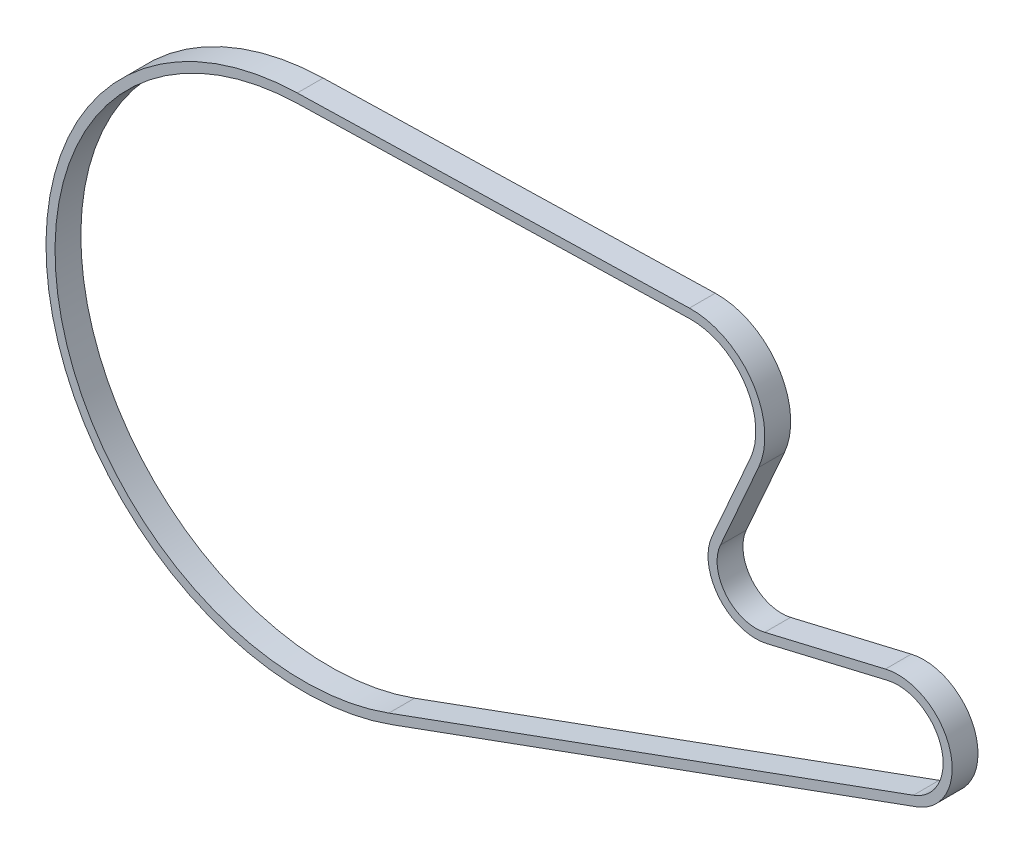
ISO-10303-21;
HEADER;
FILE_DESCRIPTION(('STEP AP214'),'2;1');
FILE_NAME('part.step','',(''),(''),'','','');
FILE_SCHEMA(('AUTOMOTIVE_DESIGN { 1 0 10303 214 1 1 1 1 }'));
ENDSEC;
DATA;
#1=APPLICATION_CONTEXT('core data for automotive mechanical design processes');
#2=APPLICATION_PROTOCOL_DEFINITION('international standard','automotive_design',2000,#1);
#3=PRODUCT_CONTEXT('',#1,'mechanical');
#4=PRODUCT('Part','Part','',(#3));
#5=PRODUCT_RELATED_PRODUCT_CATEGORY('part','',(#4));
#6=PRODUCT_DEFINITION_FORMATION('','',#4);
#7=PRODUCT_DEFINITION_CONTEXT('part definition',#1,'design');
#8=PRODUCT_DEFINITION('design','',#6,#7);
#9=PRODUCT_DEFINITION_SHAPE('','',#8);
#10=(LENGTH_UNIT() NAMED_UNIT(*) SI_UNIT(.MILLI.,.METRE.));
#11=(NAMED_UNIT(*) PLANE_ANGLE_UNIT() SI_UNIT($,.RADIAN.));
#12=(NAMED_UNIT(*) SI_UNIT($,.STERADIAN.) SOLID_ANGLE_UNIT());
#13=UNCERTAINTY_MEASURE_WITH_UNIT(LENGTH_MEASURE(1.E-05),#10,'distance_accuracy_value','');
#14=(GEOMETRIC_REPRESENTATION_CONTEXT(3) GLOBAL_UNCERTAINTY_ASSIGNED_CONTEXT((#13)) GLOBAL_UNIT_ASSIGNED_CONTEXT((#10,
#11,#12)) REPRESENTATION_CONTEXT('',''));
#15=CARTESIAN_POINT('',(0.,0.,0.));
#16=DIRECTION('',(0.,0.,1.));
#17=DIRECTION('',(1.,0.,0.));
#18=AXIS2_PLACEMENT_3D('',#15,#16,#17);
#19=CARTESIAN_POINT('',(0.,0.,2.));
#20=DIRECTION('',(0.,0.,1.));
#21=DIRECTION('',(1.,0.,0.));
#22=AXIS2_PLACEMENT_3D('',#19,#20,#21);
#23=PLANE('',#22);
#24=CARTESIAN_POINT('',(0.,0.,2.));
#25=DIRECTION('',(0.,0.,1.));
#26=DIRECTION('',(1.,0.,0.));
#27=AXIS2_PLACEMENT_3D('',#24,#25,#26);
#28=CIRCLE('',#27,19.95);
#29=CARTESIAN_POINT('',(-0.495670709518835,19.9438414190377,2.));
#30=VERTEX_POINT('',#29);
#31=CARTESIAN_POINT('',(6.83070652173879,-18.7441710516596,2.));
#32=VERTEX_POINT('',#31);
#33=EDGE_CURVE('E246',#30,#32,#28,.T.);
#34=ORIENTED_EDGE('',*,*,#33,.T.);
#35=DIRECTION('',(0.939557446198478,0.342391304347809,0.));
#36=VECTOR('',#35,1.);
#37=CARTESIAN_POINT('',(6.83070652173879,-18.7441710516596,2.));
#38=LINE('',#37,#36);
#39=CARTESIAN_POINT('',(47.4380434782631,-3.9461412740336,2.));
#40=VERTEX_POINT('',#39);
#41=EDGE_CURVE('E250',#32,#40,#38,.T.);
#42=ORIENTED_EDGE('',*,*,#41,.T.);
#43=CARTESIAN_POINT('',(46.0000000000023,0.,2.));
#44=DIRECTION('',(0.,0.,1.));
#45=DIRECTION('',(1.,0.,0.));
#46=AXIS2_PLACEMENT_3D('',#43,#44,#45);
#47=CIRCLE('',#46,4.19999999999999);
#48=CARTESIAN_POINT('',(45.0343818497446,4.08749086701033,2.));
#49=VERTEX_POINT('',#48);
#50=EDGE_CURVE('E254',#40,#49,#47,.T.);
#51=ORIENTED_EDGE('',*,*,#50,.T.);
#52=DIRECTION('',(-0.973212111192934,-0.229909083394701,0.));
#53=VECTOR('',#52,1.);
#54=CARTESIAN_POINT('',(45.0343818497446,4.08749086701033,2.));
#55=LINE('',#54,#53);
#56=CARTESIAN_POINT('',(35.6915455822925,1.8803636664212,2.));
#57=VERTEX_POINT('',#56);
#58=EDGE_CURVE('E257',#49,#57,#55,.T.);
#59=ORIENTED_EDGE('',*,*,#58,.T.);
#60=CARTESIAN_POINT('',(35.0018183321084,4.8,2.));
#61=DIRECTION('',(0.,0.,-1.));
#62=DIRECTION('',(1.,0.,0.));
#63=AXIS2_PLACEMENT_3D('',#60,#61,#62);
#64=CIRCLE('',#63,3.);
#65=CARTESIAN_POINT('',(32.2581623249961,6.01340500849347,2.));
#66=VERTEX_POINT('',#65);
#67=EDGE_CURVE('E260',#57,#66,#64,.T.);
#68=ORIENTED_EDGE('',*,*,#67,.T.);
#69=DIRECTION('',(0.40446833616449,0.914552002370739,0.));
#70=VECTOR('',#69,1.);
#71=CARTESIAN_POINT('',(35.2129464135156,12.6945304838624,2.));
#72=LINE('',#71,#70);
#73=CARTESIAN_POINT('',(35.2129464135156,12.6945304838624,2.));
#74=VERTEX_POINT('',#73);
#75=EDGE_CURVE('E263',#66,#74,#72,.T.);
#76=ORIENTED_EDGE('',*,*,#75,.T.);
#77=CARTESIAN_POINT('',(30.0000000000023,15.,2.));
#78=DIRECTION('',(0.,0.,1.));
#79=DIRECTION('',(1.,0.,0.));
#80=AXIS2_PLACEMENT_3D('',#77,#78,#79);
#81=CIRCLE('',#80,5.70000000000003);
#82=CARTESIAN_POINT('',(29.8583797972826,20.6982404054394,2.));
#83=VERTEX_POINT('',#82);
#84=EDGE_CURVE('E266',#74,#83,#81,.T.);
#85=ORIENTED_EDGE('',*,*,#84,.T.);
#86=DIRECTION('',(-0.999691299199886,-0.0248456495999414,0.));
#87=VECTOR('',#86,1.);
#88=CARTESIAN_POINT('',(29.8583797972826,20.6982404054394,2.));
#89=LINE('',#88,#87);
#90=EDGE_CURVE('E269',#83,#30,#89,.T.);
#91=ORIENTED_EDGE('',*,*,#90,.T.);
#92=EDGE_LOOP('',(#34,#42,#51,#59,#68,#76,#85,#91));
#93=FACE_BOUND('',#92,.T.);
#94=DIRECTION('',(0.939557446198478,0.342391304347809,0.));
#95=VECTOR('',#94,1.);
#96=CARTESIAN_POINT('',(6.59103260869532,-18.0864808393207,2.));
#97=LINE('',#96,#95);
#98=CARTESIAN_POINT('',(6.59103260869532,-18.0864808393207,2.));
#99=VERTEX_POINT('',#98);
#100=CARTESIAN_POINT('',(47.1983695652196,-3.28845106169467,2.));
#101=VERTEX_POINT('',#100);
#102=EDGE_CURVE('E166',#99,#101,#97,.T.);
#103=ORIENTED_EDGE('',*,*,#102,.F.);
#104=CARTESIAN_POINT('',(0.,0.,2.));
#105=DIRECTION('',(0.,0.,1.));
#106=DIRECTION('',(1.,0.,0.));
#107=AXIS2_PLACEMENT_3D('',#104,#105,#106);
#108=CIRCLE('',#107,19.25);
#109=CARTESIAN_POINT('',(-0.478278754798875,19.2440575095978,2.));
#110=VERTEX_POINT('',#109);
#111=EDGE_CURVE('E157',#110,#99,#108,.T.);
#112=ORIENTED_EDGE('',*,*,#111,.F.);
#113=DIRECTION('',(-0.999691299199886,-0.0248456495999413,0.));
#114=VECTOR('',#113,1.);
#115=CARTESIAN_POINT('',(29.8757717520026,19.9984564959994,2.));
#116=LINE('',#115,#114);
#117=CARTESIAN_POINT('',(29.8757717520026,19.9984564959994,2.));
#118=VERTEX_POINT('',#117);
#119=EDGE_CURVE('E198',#118,#110,#116,.T.);
#120=ORIENTED_EDGE('',*,*,#119,.F.);
#121=CARTESIAN_POINT('',(30.0000000000023,15.,2.));
#122=DIRECTION('',(0.,0.,1.));
#123=DIRECTION('',(1.,0.,0.));
#124=AXIS2_PLACEMENT_3D('',#121,#122,#123);
#125=CIRCLE('',#124,5.00000000000003);
#126=CARTESIAN_POINT('',(34.5727600118561,12.9776583191775,2.));
#127=VERTEX_POINT('',#126);
#128=EDGE_CURVE('E195',#127,#118,#125,.T.);
#129=ORIENTED_EDGE('',*,*,#128,.F.);
#130=DIRECTION('',(0.40446833616449,0.914552002370739,0.));
#131=VECTOR('',#130,1.);
#132=CARTESIAN_POINT('',(34.5727600118561,12.9776583191775,2.));
#133=LINE('',#132,#131);
#134=CARTESIAN_POINT('',(31.6179759233366,6.29653284380861,2.));
#135=VERTEX_POINT('',#134);
#136=EDGE_CURVE('E192',#135,#127,#133,.T.);
#137=ORIENTED_EDGE('',*,*,#136,.F.);
#138=CARTESIAN_POINT('',(35.0018183321084,4.8,2.));
#139=DIRECTION('',(0.,0.,-1.));
#140=DIRECTION('',(1.,0.,0.));
#141=AXIS2_PLACEMENT_3D('',#138,#139,#140);
#142=CIRCLE('',#141,3.7);
#143=CARTESIAN_POINT('',(35.8524819406688,1.19911518858614,2.));
#144=VERTEX_POINT('',#143);
#145=EDGE_CURVE('E189',#144,#135,#142,.T.);
#146=ORIENTED_EDGE('',*,*,#145,.F.);
#147=DIRECTION('',(-0.973212111192934,-0.229909083394701,0.));
#148=VECTOR('',#147,1.);
#149=CARTESIAN_POINT('',(45.1953182081209,3.40624238917527,2.));
#150=LINE('',#149,#148);
#151=CARTESIAN_POINT('',(45.1953182081209,3.40624238917528,2.));
#152=VERTEX_POINT('',#151);
#153=EDGE_CURVE('E184',#152,#144,#150,.T.);
#154=ORIENTED_EDGE('',*,*,#153,.F.);
#155=CARTESIAN_POINT('',(46.0000000000023,0.,2.));
#156=DIRECTION('',(0.,0.,1.));
#157=DIRECTION('',(1.,0.,0.));
#158=AXIS2_PLACEMENT_3D('',#155,#156,#157);
#159=CIRCLE('',#158,3.49999999999999);
#160=EDGE_CURVE('E180',#101,#152,#159,.T.);
#161=ORIENTED_EDGE('',*,*,#160,.F.);
#162=EDGE_LOOP('',(#103,#112,#120,#129,#137,#146,#154,#161));
#163=FACE_BOUND('',#162,.T.);
#164=ADVANCED_FACE('F43',(#93,#163),#23,.T.);
#165=CARTESIAN_POINT('',(0.,0.,0.));
#166=DIRECTION('',(0.,0.,1.));
#167=DIRECTION('',(1.,0.,0.));
#168=AXIS2_PLACEMENT_3D('',#165,#166,#167);
#169=PLANE('',#168);
#170=CARTESIAN_POINT('',(0.,0.,0.));
#171=DIRECTION('',(0.,0.,1.));
#172=DIRECTION('',(1.,0.,0.));
#173=AXIS2_PLACEMENT_3D('',#170,#171,#172);
#174=CIRCLE('',#173,19.95);
#175=CARTESIAN_POINT('',(-0.495670709518835,19.9438414190377,0.));
#176=VERTEX_POINT('',#175);
#177=CARTESIAN_POINT('',(6.83070652173879,-18.7441710516596,0.));
#178=VERTEX_POINT('',#177);
#179=EDGE_CURVE('E175',#176,#178,#174,.T.);
#180=ORIENTED_EDGE('',*,*,#179,.F.);
#181=DIRECTION('',(-0.999691299199886,-0.0248456495999414,0.));
#182=VECTOR('',#181,1.);
#183=CARTESIAN_POINT('',(29.8583797972826,20.6982404054394,0.));
#184=LINE('',#183,#182);
#185=CARTESIAN_POINT('',(29.8583797972826,20.6982404054394,0.));
#186=VERTEX_POINT('',#185);
#187=EDGE_CURVE('E251',#186,#176,#184,.T.);
#188=ORIENTED_EDGE('',*,*,#187,.F.);
#189=CARTESIAN_POINT('',(30.0000000000023,15.,0.));
#190=DIRECTION('',(0.,0.,1.));
#191=DIRECTION('',(1.,0.,0.));
#192=AXIS2_PLACEMENT_3D('',#189,#190,#191);
#193=CIRCLE('',#192,5.70000000000003);
#194=CARTESIAN_POINT('',(35.2129464135156,12.6945304838624,0.));
#195=VERTEX_POINT('',#194);
#196=EDGE_CURVE('E291',#195,#186,#193,.T.);
#197=ORIENTED_EDGE('',*,*,#196,.F.);
#198=DIRECTION('',(0.40446833616449,0.914552002370739,0.));
#199=VECTOR('',#198,1.);
#200=CARTESIAN_POINT('',(35.2129464135156,12.6945304838624,0.));
#201=LINE('',#200,#199);
#202=CARTESIAN_POINT('',(32.2581623249961,6.01340500849347,0.));
#203=VERTEX_POINT('',#202);
#204=EDGE_CURVE('E288',#203,#195,#201,.T.);
#205=ORIENTED_EDGE('',*,*,#204,.F.);
#206=CARTESIAN_POINT('',(35.0018183321084,4.8,0.));
#207=DIRECTION('',(0.,0.,-1.));
#208=DIRECTION('',(1.,0.,0.));
#209=AXIS2_PLACEMENT_3D('',#206,#207,#208);
#210=CIRCLE('',#209,3.);
#211=CARTESIAN_POINT('',(35.6915455822925,1.8803636664212,0.));
#212=VERTEX_POINT('',#211);
#213=EDGE_CURVE('E285',#212,#203,#210,.T.);
#214=ORIENTED_EDGE('',*,*,#213,.F.);
#215=DIRECTION('',(-0.973212111192934,-0.229909083394701,0.));
#216=VECTOR('',#215,1.);
#217=CARTESIAN_POINT('',(45.0343818497446,4.08749086701033,0.));
#218=LINE('',#217,#216);
#219=CARTESIAN_POINT('',(45.0343818497446,4.08749086701033,0.));
#220=VERTEX_POINT('',#219);
#221=EDGE_CURVE('E282',#220,#212,#218,.T.);
#222=ORIENTED_EDGE('',*,*,#221,.F.);
#223=CARTESIAN_POINT('',(46.0000000000023,0.,0.));
#224=DIRECTION('',(0.,0.,1.));
#225=DIRECTION('',(1.,0.,0.));
#226=AXIS2_PLACEMENT_3D('',#223,#224,#225);
#227=CIRCLE('',#226,4.19999999999999);
#228=CARTESIAN_POINT('',(47.4380434782631,-3.9461412740336,0.));
#229=VERTEX_POINT('',#228);
#230=EDGE_CURVE('E279',#229,#220,#227,.T.);
#231=ORIENTED_EDGE('',*,*,#230,.F.);
#232=DIRECTION('',(0.939557446198478,0.342391304347809,0.));
#233=VECTOR('',#232,1.);
#234=CARTESIAN_POINT('',(6.83070652173879,-18.7441710516596,0.));
#235=LINE('',#234,#233);
#236=EDGE_CURVE('E276',#178,#229,#235,.T.);
#237=ORIENTED_EDGE('',*,*,#236,.F.);
#238=EDGE_LOOP('',(#180,#188,#197,#205,#214,#222,#231,#237));
#239=FACE_BOUND('',#238,.T.);
#240=CARTESIAN_POINT('',(0.,0.,0.));
#241=DIRECTION('',(0.,0.,1.));
#242=DIRECTION('',(1.,0.,0.));
#243=AXIS2_PLACEMENT_3D('',#240,#241,#242);
#244=CIRCLE('',#243,19.25);
#245=CARTESIAN_POINT('',(-0.478278754798875,19.2440575095978,0.));
#246=VERTEX_POINT('',#245);
#247=CARTESIAN_POINT('',(6.59103260869532,-18.0864808393207,0.));
#248=VERTEX_POINT('',#247);
#249=EDGE_CURVE('E67',#246,#248,#244,.T.);
#250=ORIENTED_EDGE('',*,*,#249,.T.);
#251=DIRECTION('',(0.939557446198478,0.342391304347809,0.));
#252=VECTOR('',#251,1.);
#253=CARTESIAN_POINT('',(6.59103260869532,-18.0864808393207,0.));
#254=LINE('',#253,#252);
#255=CARTESIAN_POINT('',(47.1983695652196,-3.28845106169467,0.));
#256=VERTEX_POINT('',#255);
#257=EDGE_CURVE('E173',#248,#256,#254,.T.);
#258=ORIENTED_EDGE('',*,*,#257,.T.);
#259=CARTESIAN_POINT('',(46.0000000000023,0.,0.));
#260=DIRECTION('',(0.,0.,1.));
#261=DIRECTION('',(1.,0.,0.));
#262=AXIS2_PLACEMENT_3D('',#259,#260,#261);
#263=CIRCLE('',#262,3.49999999999999);
#264=CARTESIAN_POINT('',(45.1953182081209,3.40624238917528,0.));
#265=VERTEX_POINT('',#264);
#266=EDGE_CURVE('E205',#256,#265,#263,.T.);
#267=ORIENTED_EDGE('',*,*,#266,.T.);
#268=DIRECTION('',(-0.973212111192934,-0.229909083394701,0.));
#269=VECTOR('',#268,1.);
#270=CARTESIAN_POINT('',(45.1953182081209,3.40624238917527,0.));
#271=LINE('',#270,#269);
#272=CARTESIAN_POINT('',(35.8524819406688,1.19911518858614,0.));
#273=VERTEX_POINT('',#272);
#274=EDGE_CURVE('E209',#265,#273,#271,.T.);
#275=ORIENTED_EDGE('',*,*,#274,.T.);
#276=CARTESIAN_POINT('',(35.0018183321084,4.8,0.));
#277=DIRECTION('',(0.,0.,-1.));
#278=DIRECTION('',(1.,0.,0.));
#279=AXIS2_PLACEMENT_3D('',#276,#277,#278);
#280=CIRCLE('',#279,3.7);
#281=CARTESIAN_POINT('',(31.6179759233366,6.29653284380861,0.));
#282=VERTEX_POINT('',#281);
#283=EDGE_CURVE('E213',#273,#282,#280,.T.);
#284=ORIENTED_EDGE('',*,*,#283,.T.);
#285=DIRECTION('',(0.40446833616449,0.914552002370739,0.));
#286=VECTOR('',#285,1.);
#287=CARTESIAN_POINT('',(34.5727600118561,12.9776583191775,0.));
#288=LINE('',#287,#286);
#289=CARTESIAN_POINT('',(34.5727600118561,12.9776583191775,0.));
#290=VERTEX_POINT('',#289);
#291=EDGE_CURVE('E217',#282,#290,#288,.T.);
#292=ORIENTED_EDGE('',*,*,#291,.T.);
#293=CARTESIAN_POINT('',(30.0000000000023,15.,0.));
#294=DIRECTION('',(0.,0.,1.));
#295=DIRECTION('',(1.,0.,0.));
#296=AXIS2_PLACEMENT_3D('',#293,#294,#295);
#297=CIRCLE('',#296,5.00000000000003);
#298=CARTESIAN_POINT('',(29.8757717520026,19.9984564959995,0.));
#299=VERTEX_POINT('',#298);
#300=EDGE_CURVE('E221',#290,#299,#297,.T.);
#301=ORIENTED_EDGE('',*,*,#300,.T.);
#302=DIRECTION('',(-0.999691299199886,-0.0248456495999413,0.));
#303=VECTOR('',#302,1.);
#304=CARTESIAN_POINT('',(29.8757717520026,19.9984564959994,0.));
#305=LINE('',#304,#303);
#306=EDGE_CURVE('E167',#299,#246,#305,.T.);
#307=ORIENTED_EDGE('',*,*,#306,.T.);
#308=EDGE_LOOP('',(#250,#258,#267,#275,#284,#292,#301,#307));
#309=FACE_BOUND('',#308,.T.);
#310=ADVANCED_FACE('F330',(#239,#309),#169,.F.);
#311=CARTESIAN_POINT('',(0.,0.,2.));
#312=DIRECTION('',(0.,0.,-1.));
#313=DIRECTION('',(-1.,0.,0.));
#314=AXIS2_PLACEMENT_3D('',#311,#312,#313);
#315=CYLINDRICAL_SURFACE('',#314,19.95);
#316=ORIENTED_EDGE('',*,*,#179,.T.);
#317=DIRECTION('',(0.,0.,-1.));
#318=VECTOR('',#317,1.);
#319=CARTESIAN_POINT('',(6.83070652173879,-18.7441710516596,2.));
#320=LINE('',#319,#318);
#321=EDGE_CURVE('E11',#32,#178,#320,.T.);
#322=ORIENTED_EDGE('',*,*,#321,.F.);
#323=ORIENTED_EDGE('',*,*,#33,.F.);
#324=DIRECTION('',(0.,0.,-1.));
#325=VECTOR('',#324,1.);
#326=CARTESIAN_POINT('',(-0.495670709518835,19.9438414190377,2.));
#327=LINE('',#326,#325);
#328=EDGE_CURVE('E272',#30,#176,#327,.T.);
#329=ORIENTED_EDGE('',*,*,#328,.T.);
#330=EDGE_LOOP('',(#316,#322,#323,#329));
#331=FACE_BOUND('',#330,.T.);
#332=ADVANCED_FACE('F45',(#331),#315,.T.);
#333=CARTESIAN_POINT('',(6.83070652173879,-18.7441710516596,2.));
#334=DIRECTION('',(-0.342391304347809,0.939557446198478,0.));
#335=DIRECTION('',(-0.939557446198478,-0.342391304347809,0.));
#336=AXIS2_PLACEMENT_3D('',#333,#334,#335);
#337=PLANE('',#336);
#338=ORIENTED_EDGE('',*,*,#236,.T.);
#339=DIRECTION('',(0.,0.,-1.));
#340=VECTOR('',#339,1.);
#341=CARTESIAN_POINT('',(47.4380434782631,-3.9461412740336,2.));
#342=LINE('',#341,#340);
#343=EDGE_CURVE('E52',#40,#229,#342,.T.);
#344=ORIENTED_EDGE('',*,*,#343,.F.);
#345=ORIENTED_EDGE('',*,*,#41,.F.);
#346=ORIENTED_EDGE('',*,*,#321,.T.);
#347=EDGE_LOOP('',(#338,#344,#345,#346));
#348=FACE_BOUND('',#347,.T.);
#349=ADVANCED_FACE('F347',(#348),#337,.F.);
#350=CARTESIAN_POINT('',(46.0000000000023,0.,2.));
#351=DIRECTION('',(0.,0.,-1.));
#352=DIRECTION('',(-1.,0.,0.));
#353=AXIS2_PLACEMENT_3D('',#350,#351,#352);
#354=CYLINDRICAL_SURFACE('',#353,4.19999999999999);
#355=ORIENTED_EDGE('',*,*,#230,.T.);
#356=DIRECTION('',(0.,0.,-1.));
#357=VECTOR('',#356,1.);
#358=CARTESIAN_POINT('',(45.0343818497446,4.08749086701033,2.));
#359=LINE('',#358,#357);
#360=EDGE_CURVE('E315',#49,#220,#359,.T.);
#361=ORIENTED_EDGE('',*,*,#360,.F.);
#362=ORIENTED_EDGE('',*,*,#50,.F.);
#363=ORIENTED_EDGE('',*,*,#343,.T.);
#364=EDGE_LOOP('',(#355,#361,#362,#363));
#365=FACE_BOUND('',#364,.T.);
#366=ADVANCED_FACE('F324',(#365),#354,.T.);
#367=CARTESIAN_POINT('',(45.0343818497446,4.08749086701033,2.));
#368=DIRECTION('',(0.229909083394701,-0.973212111192934,0.));
#369=DIRECTION('',(0.973212111192934,0.229909083394701,0.));
#370=AXIS2_PLACEMENT_3D('',#367,#368,#369);
#371=PLANE('',#370);
#372=ORIENTED_EDGE('',*,*,#221,.T.);
#373=DIRECTION('',(0.,0.,-1.));
#374=VECTOR('',#373,1.);
#375=CARTESIAN_POINT('',(35.6915455822925,1.8803636664212,2.));
#376=LINE('',#375,#374);
#377=EDGE_CURVE('E311',#57,#212,#376,.T.);
#378=ORIENTED_EDGE('',*,*,#377,.F.);
#379=ORIENTED_EDGE('',*,*,#58,.F.);
#380=ORIENTED_EDGE('',*,*,#360,.T.);
#381=EDGE_LOOP('',(#372,#378,#379,#380));
#382=FACE_BOUND('',#381,.T.);
#383=ADVANCED_FACE('F336',(#382),#371,.F.);
#384=CARTESIAN_POINT('',(35.0018183321084,4.8,2.));
#385=DIRECTION('',(0.,0.,-1.));
#386=DIRECTION('',(-1.,0.,0.));
#387=AXIS2_PLACEMENT_3D('',#384,#385,#386);
#388=CYLINDRICAL_SURFACE('',#387,3.);
#389=ORIENTED_EDGE('',*,*,#213,.T.);
#390=DIRECTION('',(0.,0.,-1.));
#391=VECTOR('',#390,1.);
#392=CARTESIAN_POINT('',(32.2581623249961,6.01340500849347,2.));
#393=LINE('',#392,#391);
#394=EDGE_CURVE('E307',#66,#203,#393,.T.);
#395=ORIENTED_EDGE('',*,*,#394,.F.);
#396=ORIENTED_EDGE('',*,*,#67,.F.);
#397=ORIENTED_EDGE('',*,*,#377,.T.);
#398=EDGE_LOOP('',(#389,#395,#396,#397));
#399=FACE_BOUND('',#398,.T.);
#400=ADVANCED_FACE('F340',(#399),#388,.F.);
#401=CARTESIAN_POINT('',(35.2129464135156,12.6945304838624,2.));
#402=DIRECTION('',(-0.914552002370739,0.40446833616449,0.));
#403=DIRECTION('',(-0.404468336164491,-0.91455200237074,0.));
#404=AXIS2_PLACEMENT_3D('',#401,#402,#403);
#405=PLANE('',#404);
#406=ORIENTED_EDGE('',*,*,#204,.T.);
#407=DIRECTION('',(0.,0.,-1.));
#408=VECTOR('',#407,1.);
#409=CARTESIAN_POINT('',(35.2129464135156,12.6945304838624,2.));
#410=LINE('',#409,#408);
#411=EDGE_CURVE('E303',#74,#195,#410,.T.);
#412=ORIENTED_EDGE('',*,*,#411,.F.);
#413=ORIENTED_EDGE('',*,*,#75,.F.);
#414=ORIENTED_EDGE('',*,*,#394,.T.);
#415=EDGE_LOOP('',(#406,#412,#413,#414));
#416=FACE_BOUND('',#415,.T.);
#417=ADVANCED_FACE('F360',(#416),#405,.F.);
#418=CARTESIAN_POINT('',(30.0000000000023,15.,2.));
#419=DIRECTION('',(0.,0.,-1.));
#420=DIRECTION('',(-1.,0.,0.));
#421=AXIS2_PLACEMENT_3D('',#418,#419,#420);
#422=CYLINDRICAL_SURFACE('',#421,5.70000000000003);
#423=ORIENTED_EDGE('',*,*,#196,.T.);
#424=DIRECTION('',(0.,0.,-1.));
#425=VECTOR('',#424,1.);
#426=CARTESIAN_POINT('',(29.8583797972826,20.6982404054394,2.));
#427=LINE('',#426,#425);
#428=EDGE_CURVE('E299',#83,#186,#427,.T.);
#429=ORIENTED_EDGE('',*,*,#428,.F.);
#430=ORIENTED_EDGE('',*,*,#84,.F.);
#431=ORIENTED_EDGE('',*,*,#411,.T.);
#432=EDGE_LOOP('',(#423,#429,#430,#431));
#433=FACE_BOUND('',#432,.T.);
#434=ADVANCED_FACE('F358',(#433),#422,.T.);
#435=CARTESIAN_POINT('',(29.8583797972826,20.6982404054394,2.));
#436=DIRECTION('',(0.0248456495999414,-0.999691299199886,0.));
#437=DIRECTION('',(0.999691299199887,0.0248456495999414,0.));
#438=AXIS2_PLACEMENT_3D('',#435,#436,#437);
#439=PLANE('',#438);
#440=ORIENTED_EDGE('',*,*,#187,.T.);
#441=ORIENTED_EDGE('',*,*,#328,.F.);
#442=ORIENTED_EDGE('',*,*,#90,.F.);
#443=ORIENTED_EDGE('',*,*,#428,.T.);
#444=EDGE_LOOP('',(#440,#441,#442,#443));
#445=FACE_BOUND('',#444,.T.);
#446=ADVANCED_FACE('F353',(#445),#439,.F.);
#447=CARTESIAN_POINT('',(0.,0.,2.));
#448=DIRECTION('',(0.,0.,-1.));
#449=DIRECTION('',(-1.,0.,0.));
#450=AXIS2_PLACEMENT_3D('',#447,#448,#449);
#451=CYLINDRICAL_SURFACE('',#450,19.25);
#452=ORIENTED_EDGE('',*,*,#249,.F.);
#453=DIRECTION('',(0.,0.,-1.));
#454=VECTOR('',#453,1.);
#455=CARTESIAN_POINT('',(-0.478278754798875,19.2440575095978,2.));
#456=LINE('',#455,#454);
#457=EDGE_CURVE('E161',#110,#246,#456,.T.);
#458=ORIENTED_EDGE('',*,*,#457,.F.);
#459=ORIENTED_EDGE('',*,*,#111,.T.);
#460=DIRECTION('',(0.,0.,-1.));
#461=VECTOR('',#460,1.);
#462=CARTESIAN_POINT('',(6.59103260869532,-18.0864808393207,2.));
#463=LINE('',#462,#461);
#464=EDGE_CURVE('E160',#99,#248,#463,.T.);
#465=ORIENTED_EDGE('',*,*,#464,.T.);
#466=EDGE_LOOP('',(#452,#458,#459,#465));
#467=FACE_BOUND('',#466,.T.);
#468=ADVANCED_FACE('F159',(#467),#451,.F.);
#469=CARTESIAN_POINT('',(6.59103260869532,-18.0864808393207,2.));
#470=DIRECTION('',(-0.342391304347809,0.939557446198478,0.));
#471=DIRECTION('',(-0.939557446198478,-0.342391304347809,0.));
#472=AXIS2_PLACEMENT_3D('',#469,#470,#471);
#473=PLANE('',#472);
#474=ORIENTED_EDGE('',*,*,#257,.F.);
#475=ORIENTED_EDGE('',*,*,#464,.F.);
#476=ORIENTED_EDGE('',*,*,#102,.T.);
#477=DIRECTION('',(0.,0.,-1.));
#478=VECTOR('',#477,1.);
#479=CARTESIAN_POINT('',(47.1983695652196,-3.28845106169467,2.));
#480=LINE('',#479,#478);
#481=EDGE_CURVE('E176',#101,#256,#480,.T.);
#482=ORIENTED_EDGE('',*,*,#481,.T.);
#483=EDGE_LOOP('',(#474,#475,#476,#482));
#484=FACE_BOUND('',#483,.T.);
#485=ADVANCED_FACE('F170',(#484),#473,.T.);
#486=CARTESIAN_POINT('',(46.0000000000023,0.,2.));
#487=DIRECTION('',(0.,0.,-1.));
#488=DIRECTION('',(-1.,0.,0.));
#489=AXIS2_PLACEMENT_3D('',#486,#487,#488);
#490=CYLINDRICAL_SURFACE('',#489,3.49999999999999);
#491=ORIENTED_EDGE('',*,*,#266,.F.);
#492=ORIENTED_EDGE('',*,*,#481,.F.);
#493=ORIENTED_EDGE('',*,*,#160,.T.);
#494=DIRECTION('',(0.,0.,-1.));
#495=VECTOR('',#494,1.);
#496=CARTESIAN_POINT('',(45.1953182081209,3.40624238917528,2.));
#497=LINE('',#496,#495);
#498=EDGE_CURVE('E241',#152,#265,#497,.T.);
#499=ORIENTED_EDGE('',*,*,#498,.T.);
#500=EDGE_LOOP('',(#491,#492,#493,#499));
#501=FACE_BOUND('',#500,.T.);
#502=ADVANCED_FACE('F385',(#501),#490,.F.);
#503=CARTESIAN_POINT('',(45.1953182081209,3.40624238917527,2.));
#504=DIRECTION('',(0.229909083394701,-0.973212111192934,0.));
#505=DIRECTION('',(0.973212111192934,0.229909083394701,0.));
#506=AXIS2_PLACEMENT_3D('',#503,#504,#505);
#507=PLANE('',#506);
#508=ORIENTED_EDGE('',*,*,#274,.F.);
#509=ORIENTED_EDGE('',*,*,#498,.F.);
#510=ORIENTED_EDGE('',*,*,#153,.T.);
#511=DIRECTION('',(0.,0.,-1.));
#512=VECTOR('',#511,1.);
#513=CARTESIAN_POINT('',(35.8524819406688,1.19911518858614,2.));
#514=LINE('',#513,#512);
#515=EDGE_CURVE('E238',#144,#273,#514,.T.);
#516=ORIENTED_EDGE('',*,*,#515,.T.);
#517=EDGE_LOOP('',(#508,#509,#510,#516));
#518=FACE_BOUND('',#517,.T.);
#519=ADVANCED_FACE('F389',(#518),#507,.T.);
#520=CARTESIAN_POINT('',(35.0018183321084,4.8,2.));
#521=DIRECTION('',(0.,0.,-1.));
#522=DIRECTION('',(-1.,0.,0.));
#523=AXIS2_PLACEMENT_3D('',#520,#521,#522);
#524=CYLINDRICAL_SURFACE('',#523,3.7);
#525=ORIENTED_EDGE('',*,*,#283,.F.);
#526=ORIENTED_EDGE('',*,*,#515,.F.);
#527=ORIENTED_EDGE('',*,*,#145,.T.);
#528=DIRECTION('',(0.,0.,-1.));
#529=VECTOR('',#528,1.);
#530=CARTESIAN_POINT('',(31.6179759233366,6.29653284380861,2.));
#531=LINE('',#530,#529);
#532=EDGE_CURVE('E235',#135,#282,#531,.T.);
#533=ORIENTED_EDGE('',*,*,#532,.T.);
#534=EDGE_LOOP('',(#525,#526,#527,#533));
#535=FACE_BOUND('',#534,.T.);
#536=ADVANCED_FACE('F395',(#535),#524,.T.);
#537=CARTESIAN_POINT('',(34.5727600118561,12.9776583191775,2.));
#538=DIRECTION('',(-0.914552002370739,0.40446833616449,0.));
#539=DIRECTION('',(-0.404468336164491,-0.91455200237074,0.));
#540=AXIS2_PLACEMENT_3D('',#537,#538,#539);
#541=PLANE('',#540);
#542=ORIENTED_EDGE('',*,*,#291,.F.);
#543=ORIENTED_EDGE('',*,*,#532,.F.);
#544=ORIENTED_EDGE('',*,*,#136,.T.);
#545=DIRECTION('',(0.,0.,-1.));
#546=VECTOR('',#545,1.);
#547=CARTESIAN_POINT('',(34.5727600118561,12.9776583191775,2.));
#548=LINE('',#547,#546);
#549=EDGE_CURVE('E232',#127,#290,#548,.T.);
#550=ORIENTED_EDGE('',*,*,#549,.T.);
#551=EDGE_LOOP('',(#542,#543,#544,#550));
#552=FACE_BOUND('',#551,.T.);
#553=ADVANCED_FACE('F399',(#552),#541,.T.);
#554=CARTESIAN_POINT('',(30.0000000000023,15.,2.));
#555=DIRECTION('',(0.,0.,-1.));
#556=DIRECTION('',(-1.,0.,0.));
#557=AXIS2_PLACEMENT_3D('',#554,#555,#556);
#558=CYLINDRICAL_SURFACE('',#557,5.00000000000003);
#559=ORIENTED_EDGE('',*,*,#300,.F.);
#560=ORIENTED_EDGE('',*,*,#549,.F.);
#561=ORIENTED_EDGE('',*,*,#128,.T.);
#562=DIRECTION('',(0.,0.,-1.));
#563=VECTOR('',#562,1.);
#564=CARTESIAN_POINT('',(29.8757717520026,19.9984564959995,2.));
#565=LINE('',#564,#563);
#566=EDGE_CURVE('E59',#118,#299,#565,.T.);
#567=ORIENTED_EDGE('',*,*,#566,.T.);
#568=EDGE_LOOP('',(#559,#560,#561,#567));
#569=FACE_BOUND('',#568,.T.);
#570=ADVANCED_FACE('F403',(#569),#558,.F.);
#571=CARTESIAN_POINT('',(29.8757717520026,19.9984564959994,2.));
#572=DIRECTION('',(0.0248456495999413,-0.999691299199886,0.));
#573=DIRECTION('',(0.999691299199887,0.0248456495999413,0.));
#574=AXIS2_PLACEMENT_3D('',#571,#572,#573);
#575=PLANE('',#574);
#576=ORIENTED_EDGE('',*,*,#306,.F.);
#577=ORIENTED_EDGE('',*,*,#566,.F.);
#578=ORIENTED_EDGE('',*,*,#119,.T.);
#579=ORIENTED_EDGE('',*,*,#457,.T.);
#580=EDGE_LOOP('',(#576,#577,#578,#579));
#581=FACE_BOUND('',#580,.T.);
#582=ADVANCED_FACE('F407',(#581),#575,.T.);
#583=CLOSED_SHELL('',(#164,#310,#332,#349,#366,#383,#400,#417,#434,#446,#468,#485,#502,#519,
#536,#553,#570,#582));
#584=MANIFOLD_SOLID_BREP('B2',#583);
#585=ADVANCED_BREP_SHAPE_REPRESENTATION('',(#18,#584),#14);
#586=SHAPE_DEFINITION_REPRESENTATION(#9,#585);
ENDSEC;
END-ISO-10303-21;
